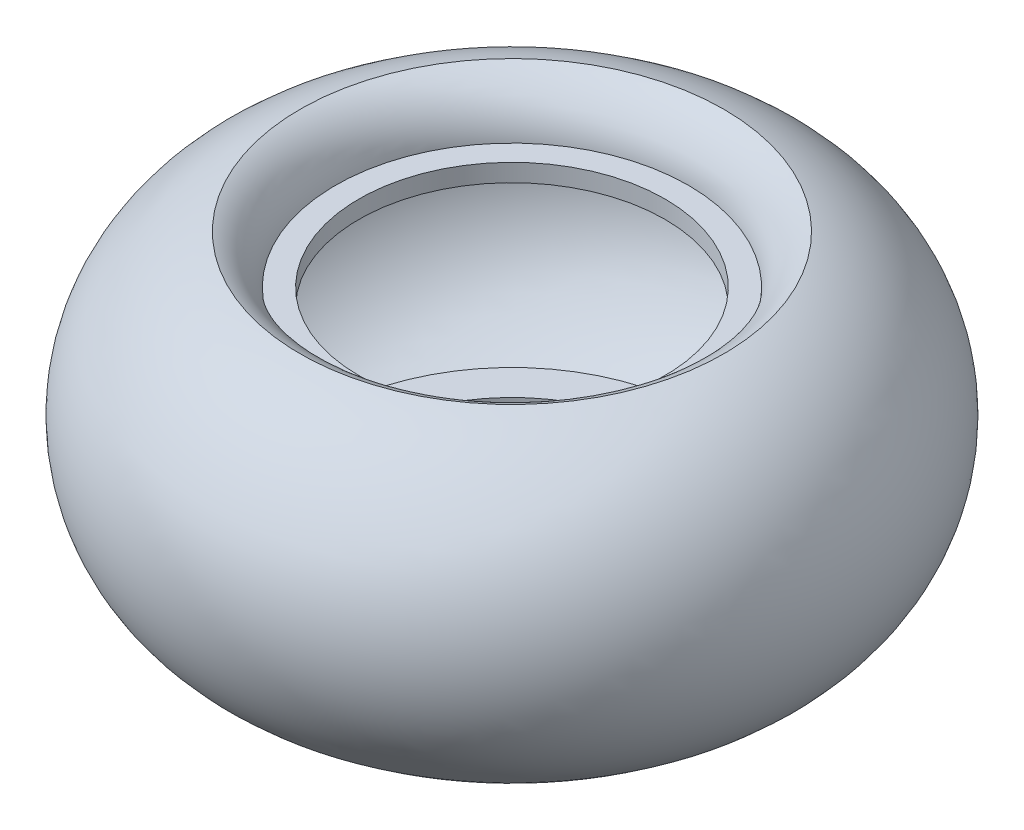
ISO-10303-21;
HEADER;
FILE_DESCRIPTION(('STEP AP214'),'2;1');
FILE_NAME('part.step','',(''),(''),'','','');
FILE_SCHEMA(('AUTOMOTIVE_DESIGN { 1 0 10303 214 1 1 1 1 }'));
ENDSEC;
DATA;
#1=APPLICATION_CONTEXT('core data for automotive mechanical design processes');
#2=APPLICATION_PROTOCOL_DEFINITION('international standard','automotive_design',2000,#1);
#3=PRODUCT_CONTEXT('',#1,'mechanical');
#4=PRODUCT('Part','Part','',(#3));
#5=PRODUCT_RELATED_PRODUCT_CATEGORY('part','',(#4));
#6=PRODUCT_DEFINITION_FORMATION('','',#4);
#7=PRODUCT_DEFINITION_CONTEXT('part definition',#1,'design');
#8=PRODUCT_DEFINITION('design','',#6,#7);
#9=PRODUCT_DEFINITION_SHAPE('','',#8);
#10=(LENGTH_UNIT() NAMED_UNIT(*) SI_UNIT(.MILLI.,.METRE.));
#11=(NAMED_UNIT(*) PLANE_ANGLE_UNIT() SI_UNIT($,.RADIAN.));
#12=(NAMED_UNIT(*) SI_UNIT($,.STERADIAN.) SOLID_ANGLE_UNIT());
#13=UNCERTAINTY_MEASURE_WITH_UNIT(LENGTH_MEASURE(1.E-05),#10,'distance_accuracy_value','');
#14=(GEOMETRIC_REPRESENTATION_CONTEXT(3) GLOBAL_UNCERTAINTY_ASSIGNED_CONTEXT((#13)) GLOBAL_UNIT_ASSIGNED_CONTEXT((#10,
#11,#12)) REPRESENTATION_CONTEXT('',''));
#15=CARTESIAN_POINT('',(0.,0.,0.));
#16=DIRECTION('',(0.,0.,1.));
#17=DIRECTION('',(1.,0.,0.));
#18=AXIS2_PLACEMENT_3D('',#15,#16,#17);
#19=CARTESIAN_POINT('',(0.,8.90686191159599,0.));
#20=DIRECTION('',(0.,-1.,0.));
#21=DIRECTION('',(0.,0.,-1.));
#22=AXIS2_PLACEMENT_3D('',#19,#20,#21);
#23=TOROIDAL_SURFACE('',#22,19.9756220541521,5.);
#24=CARTESIAN_POINT('',(0.,9.4,0.));
#25=DIRECTION('',(0.,-1.,0.));
#26=DIRECTION('',(0.,0.,-1.));
#27=AXIS2_PLACEMENT_3D('',#24,#25,#26);
#28=CIRCLE('',#27,15.);
#29=CARTESIAN_POINT('',(0.,9.4,-15.));
#30=VERTEX_POINT('',#29);
#31=EDGE_CURVE('E10',#30,#30,#28,.T.);
#32=ORIENTED_EDGE('',*,*,#31,.T.);
#33=EDGE_LOOP('',(#32));
#34=FACE_BOUND('',#33,.T.);
#35=CARTESIAN_POINT('',(0.,13.5,0.));
#36=DIRECTION('',(0.,-1.,0.));
#37=DIRECTION('',(0.,0.,-1.));
#38=AXIS2_PLACEMENT_3D('',#35,#36,#37);
#39=CIRCLE('',#38,18.);
#40=CARTESIAN_POINT('',(0.,13.5,-18.));
#41=VERTEX_POINT('',#40);
#42=EDGE_CURVE('E71',#41,#41,#39,.T.);
#43=ORIENTED_EDGE('',*,*,#42,.F.);
#44=EDGE_LOOP('',(#43));
#45=FACE_BOUND('',#44,.T.);
#46=ADVANCED_FACE('F31',(#34,#45),#23,.T.);
#47=CARTESIAN_POINT('',(15.,9.4,0.));
#48=DIRECTION('',(0.,1.,0.));
#49=DIRECTION('',(0.,0.,1.));
#50=AXIS2_PLACEMENT_3D('',#47,#48,#49);
#51=PLANE('',#50);
#52=CARTESIAN_POINT('',(0.,9.4,0.));
#53=DIRECTION('',(0.,-1.,0.));
#54=DIRECTION('',(0.,0.,-1.));
#55=AXIS2_PLACEMENT_3D('',#52,#53,#54);
#56=CIRCLE('',#55,13.);
#57=CARTESIAN_POINT('',(0.,9.4,-13.));
#58=VERTEX_POINT('',#57);
#59=EDGE_CURVE('E37',#58,#58,#56,.T.);
#60=ORIENTED_EDGE('',*,*,#59,.T.);
#61=EDGE_LOOP('',(#60));
#62=FACE_BOUND('',#61,.T.);
#63=ORIENTED_EDGE('',*,*,#31,.F.);
#64=EDGE_LOOP('',(#63));
#65=FACE_BOUND('',#64,.T.);
#66=ADVANCED_FACE('F79',(#62,#65),#51,.T.);
#67=CARTESIAN_POINT('',(0.,0.,0.));
#68=DIRECTION('',(0.,-1.,0.));
#69=DIRECTION('',(0.,0.,-1.));
#70=AXIS2_PLACEMENT_3D('',#67,#68,#69);
#71=CYLINDRICAL_SURFACE('',#70,13.);
#72=CARTESIAN_POINT('',(0.,7.9,0.));
#73=DIRECTION('',(0.,-1.,0.));
#74=DIRECTION('',(0.,0.,-1.));
#75=AXIS2_PLACEMENT_3D('',#72,#73,#74);
#76=CIRCLE('',#75,13.);
#77=CARTESIAN_POINT('',(0.,7.9,-13.));
#78=VERTEX_POINT('',#77);
#79=EDGE_CURVE('E41',#78,#78,#76,.T.);
#80=ORIENTED_EDGE('',*,*,#79,.T.);
#81=EDGE_LOOP('',(#80));
#82=FACE_BOUND('',#81,.T.);
#83=ORIENTED_EDGE('',*,*,#59,.F.);
#84=EDGE_LOOP('',(#83));
#85=FACE_BOUND('',#84,.T.);
#86=ADVANCED_FACE('F83',(#82,#85),#71,.F.);
#87=CARTESIAN_POINT('',(13.,7.9,0.));
#88=DIRECTION('',(0.,-1.,0.));
#89=DIRECTION('',(0.,0.,-1.));
#90=AXIS2_PLACEMENT_3D('',#87,#88,#89);
#91=PLANE('',#90);
#92=CARTESIAN_POINT('',(0.,7.9,0.));
#93=DIRECTION('',(0.,-1.,0.));
#94=DIRECTION('',(0.,0.,-1.));
#95=AXIS2_PLACEMENT_3D('',#92,#93,#94);
#96=CIRCLE('',#95,16.1181437261131);
#97=CARTESIAN_POINT('',(0.,7.9,-16.1181437261131));
#98=VERTEX_POINT('',#97);
#99=EDGE_CURVE('E45',#98,#98,#96,.T.);
#100=ORIENTED_EDGE('',*,*,#99,.T.);
#101=EDGE_LOOP('',(#100));
#102=FACE_BOUND('',#101,.T.);
#103=ORIENTED_EDGE('',*,*,#79,.F.);
#104=EDGE_LOOP('',(#103));
#105=FACE_BOUND('',#104,.T.);
#106=ADVANCED_FACE('F87',(#102,#105),#91,.T.);
#107=CARTESIAN_POINT('',(0.,7.9,0.));
#108=DIRECTION('',(0.,1.,0.));
#109=DIRECTION('',(0.,0.,1.));
#110=AXIS2_PLACEMENT_3D('',#107,#108,#109);
#111=CONICAL_SURFACE('',#110,16.1181437261131,0.484103639981088);
#112=CARTESIAN_POINT('',(0.,11.4066073737842,0.));
#113=DIRECTION('',(0.,-1.,0.));
#114=DIRECTION('',(0.,0.,-1.));
#115=AXIS2_PLACEMENT_3D('',#112,#113,#114);
#116=CIRCLE('',#115,17.9620508305003);
#117=CARTESIAN_POINT('',(0.,11.4066073737842,-17.9620508305003));
#118=VERTEX_POINT('',#117);
#119=EDGE_CURVE('E50',#118,#118,#116,.T.);
#120=ORIENTED_EDGE('',*,*,#119,.T.);
#121=EDGE_LOOP('',(#120));
#122=FACE_BOUND('',#121,.T.);
#123=ORIENTED_EDGE('',*,*,#99,.F.);
#124=EDGE_LOOP('',(#123));
#125=FACE_BOUND('',#124,.T.);
#126=ADVANCED_FACE('F94',(#122,#125),#111,.T.);
#127=CARTESIAN_POINT('',(0.,0.,0.));
#128=DIRECTION('',(0.,-1.,0.));
#129=DIRECTION('',(0.,0.,-1.));
#130=AXIS2_PLACEMENT_3D('',#127,#128,#129);
#131=TOROIDAL_SURFACE('',#130,13.8875,12.1125);
#132=CARTESIAN_POINT('',(0.,-11.4066073737842,0.));
#133=DIRECTION('',(0.,-1.,0.));
#134=DIRECTION('',(0.,0.,-1.));
#135=AXIS2_PLACEMENT_3D('',#132,#133,#134);
#136=CIRCLE('',#135,17.9620508305003);
#137=CARTESIAN_POINT('',(0.,-11.4066073737842,-17.9620508305003));
#138=VERTEX_POINT('',#137);
#139=EDGE_CURVE('E53',#138,#138,#136,.T.);
#140=ORIENTED_EDGE('',*,*,#139,.T.);
#141=EDGE_LOOP('',(#140));
#142=FACE_BOUND('',#141,.T.);
#143=ORIENTED_EDGE('',*,*,#119,.F.);
#144=EDGE_LOOP('',(#143));
#145=FACE_BOUND('',#144,.T.);
#146=ADVANCED_FACE('F98',(#142,#145),#131,.F.);
#147=CARTESIAN_POINT('',(0.,-11.4066073737842,0.));
#148=DIRECTION('',(0.,-1.,0.));
#149=DIRECTION('',(0.,0.,-1.));
#150=AXIS2_PLACEMENT_3D('',#147,#148,#149);
#151=CONICAL_SURFACE('',#150,17.9620508305003,0.484103639981088);
#152=CARTESIAN_POINT('',(0.,-7.9,0.));
#153=DIRECTION('',(0.,-1.,0.));
#154=DIRECTION('',(0.,0.,-1.));
#155=AXIS2_PLACEMENT_3D('',#152,#153,#154);
#156=CIRCLE('',#155,16.1181437261131);
#157=CARTESIAN_POINT('',(0.,-7.9,-16.1181437261131));
#158=VERTEX_POINT('',#157);
#159=EDGE_CURVE('E56',#158,#158,#156,.T.);
#160=ORIENTED_EDGE('',*,*,#159,.T.);
#161=EDGE_LOOP('',(#160));
#162=FACE_BOUND('',#161,.T.);
#163=ORIENTED_EDGE('',*,*,#139,.F.);
#164=EDGE_LOOP('',(#163));
#165=FACE_BOUND('',#164,.T.);
#166=ADVANCED_FACE('F102',(#162,#165),#151,.T.);
#167=CARTESIAN_POINT('',(16.1181437261131,-7.9,0.));
#168=DIRECTION('',(0.,1.,0.));
#169=DIRECTION('',(0.,0.,1.));
#170=AXIS2_PLACEMENT_3D('',#167,#168,#169);
#171=PLANE('',#170);
#172=CARTESIAN_POINT('',(0.,-7.9,0.));
#173=DIRECTION('',(0.,-1.,0.));
#174=DIRECTION('',(0.,0.,-1.));
#175=AXIS2_PLACEMENT_3D('',#172,#173,#174);
#176=CIRCLE('',#175,13.);
#177=CARTESIAN_POINT('',(0.,-7.9,-13.));
#178=VERTEX_POINT('',#177);
#179=EDGE_CURVE('E59',#178,#178,#176,.T.);
#180=ORIENTED_EDGE('',*,*,#179,.T.);
#181=EDGE_LOOP('',(#180));
#182=FACE_BOUND('',#181,.T.);
#183=ORIENTED_EDGE('',*,*,#159,.F.);
#184=EDGE_LOOP('',(#183));
#185=FACE_BOUND('',#184,.T.);
#186=ADVANCED_FACE('F106',(#182,#185),#171,.T.);
#187=CARTESIAN_POINT('',(0.,0.,0.));
#188=DIRECTION('',(0.,-1.,0.));
#189=DIRECTION('',(0.,0.,-1.));
#190=AXIS2_PLACEMENT_3D('',#187,#188,#189);
#191=CYLINDRICAL_SURFACE('',#190,13.);
#192=CARTESIAN_POINT('',(0.,-9.4,0.));
#193=DIRECTION('',(0.,-1.,0.));
#194=DIRECTION('',(0.,0.,-1.));
#195=AXIS2_PLACEMENT_3D('',#192,#193,#194);
#196=CIRCLE('',#195,13.);
#197=CARTESIAN_POINT('',(0.,-9.4,-13.));
#198=VERTEX_POINT('',#197);
#199=EDGE_CURVE('E62',#198,#198,#196,.T.);
#200=ORIENTED_EDGE('',*,*,#199,.T.);
#201=EDGE_LOOP('',(#200));
#202=FACE_BOUND('',#201,.T.);
#203=ORIENTED_EDGE('',*,*,#179,.F.);
#204=EDGE_LOOP('',(#203));
#205=FACE_BOUND('',#204,.T.);
#206=ADVANCED_FACE('F110',(#202,#205),#191,.F.);
#207=CARTESIAN_POINT('',(13.,-9.4,0.));
#208=DIRECTION('',(0.,-1.,0.));
#209=DIRECTION('',(0.,0.,-1.));
#210=AXIS2_PLACEMENT_3D('',#207,#208,#209);
#211=PLANE('',#210);
#212=CARTESIAN_POINT('',(0.,-9.4,0.));
#213=DIRECTION('',(0.,-1.,0.));
#214=DIRECTION('',(0.,0.,-1.));
#215=AXIS2_PLACEMENT_3D('',#212,#213,#214);
#216=CIRCLE('',#215,15.);
#217=CARTESIAN_POINT('',(0.,-9.4,-15.));
#218=VERTEX_POINT('',#217);
#219=EDGE_CURVE('E65',#218,#218,#216,.T.);
#220=ORIENTED_EDGE('',*,*,#219,.T.);
#221=EDGE_LOOP('',(#220));
#222=FACE_BOUND('',#221,.T.);
#223=ORIENTED_EDGE('',*,*,#199,.F.);
#224=EDGE_LOOP('',(#223));
#225=FACE_BOUND('',#224,.T.);
#226=ADVANCED_FACE('F114',(#222,#225),#211,.T.);
#227=CARTESIAN_POINT('',(0.,-8.90686191159599,0.));
#228=DIRECTION('',(0.,-1.,0.));
#229=DIRECTION('',(0.,0.,-1.));
#230=AXIS2_PLACEMENT_3D('',#227,#228,#229);
#231=TOROIDAL_SURFACE('',#230,19.9756220541521,5.);
#232=CARTESIAN_POINT('',(0.,-13.5,0.));
#233=DIRECTION('',(0.,-1.,0.));
#234=DIRECTION('',(0.,0.,-1.));
#235=AXIS2_PLACEMENT_3D('',#232,#233,#234);
#236=CIRCLE('',#235,18.);
#237=CARTESIAN_POINT('',(0.,-13.5,-18.));
#238=VERTEX_POINT('',#237);
#239=EDGE_CURVE('E68',#238,#238,#236,.T.);
#240=ORIENTED_EDGE('',*,*,#239,.T.);
#241=EDGE_LOOP('',(#240));
#242=FACE_BOUND('',#241,.T.);
#243=ORIENTED_EDGE('',*,*,#219,.F.);
#244=EDGE_LOOP('',(#243));
#245=FACE_BOUND('',#244,.T.);
#246=ADVANCED_FACE('F118',(#242,#245),#231,.T.);
#247=CARTESIAN_POINT('',(0.,0.,0.));
#248=DIRECTION('',(0.,-1.,0.));
#249=DIRECTION('',(0.,0.,-1.));
#250=AXIS2_PLACEMENT_3D('',#247,#248,#249);
#251=DEGENERATE_TOROIDAL_SURFACE('',#250,13.8875,14.1125,.T.);
#252=ORIENTED_EDGE('',*,*,#42,.T.);
#253=EDGE_LOOP('',(#252));
#254=FACE_BOUND('',#253,.T.);
#255=ORIENTED_EDGE('',*,*,#239,.F.);
#256=EDGE_LOOP('',(#255));
#257=FACE_BOUND('',#256,.T.);
#258=ADVANCED_FACE('F75',(#254,#257),#251,.T.);
#259=CLOSED_SHELL('',(#46,#66,#86,#106,#126,#146,#166,#186,#206,#226,#246,#258));
#260=MANIFOLD_SOLID_BREP('B2',#259);
#261=ADVANCED_BREP_SHAPE_REPRESENTATION('',(#18,#260),#14);
#262=SHAPE_DEFINITION_REPRESENTATION(#9,#261);
ENDSEC;
END-ISO-10303-21;
